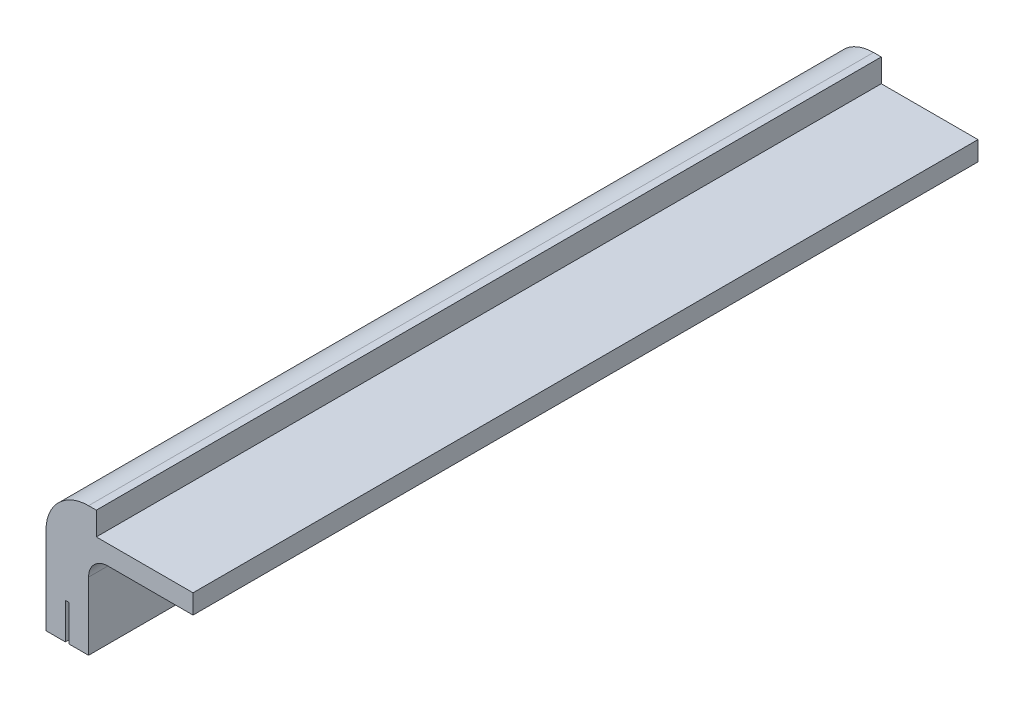
ISO-10303-21;
HEADER;
FILE_DESCRIPTION(('STEP AP214'),'2;1');
FILE_NAME('part.step','',(''),(''),'','','');
FILE_SCHEMA(('AUTOMOTIVE_DESIGN { 1 0 10303 214 1 1 1 1 }'));
ENDSEC;
DATA;
#1=APPLICATION_CONTEXT('core data for automotive mechanical design processes');
#2=APPLICATION_PROTOCOL_DEFINITION('international standard','automotive_design',2000,#1);
#3=PRODUCT_CONTEXT('',#1,'mechanical');
#4=PRODUCT('Part','Part','',(#3));
#5=PRODUCT_RELATED_PRODUCT_CATEGORY('part','',(#4));
#6=PRODUCT_DEFINITION_FORMATION('','',#4);
#7=PRODUCT_DEFINITION_CONTEXT('part definition',#1,'design');
#8=PRODUCT_DEFINITION('design','',#6,#7);
#9=PRODUCT_DEFINITION_SHAPE('','',#8);
#10=(LENGTH_UNIT() NAMED_UNIT(*) SI_UNIT(.MILLI.,.METRE.));
#11=(NAMED_UNIT(*) PLANE_ANGLE_UNIT() SI_UNIT($,.RADIAN.));
#12=(NAMED_UNIT(*) SI_UNIT($,.STERADIAN.) SOLID_ANGLE_UNIT());
#13=UNCERTAINTY_MEASURE_WITH_UNIT(LENGTH_MEASURE(1.E-05),#10,'distance_accuracy_value','');
#14=(GEOMETRIC_REPRESENTATION_CONTEXT(3) GLOBAL_UNCERTAINTY_ASSIGNED_CONTEXT((#13)) GLOBAL_UNIT_ASSIGNED_CONTEXT((#10,
#11,#12)) REPRESENTATION_CONTEXT('',''));
#15=CARTESIAN_POINT('',(0.,0.,0.));
#16=DIRECTION('',(0.,0.,1.));
#17=DIRECTION('',(1.,0.,0.));
#18=AXIS2_PLACEMENT_3D('',#15,#16,#17);
#19=CARTESIAN_POINT('',(-185.000000000001,220.,546.61442792579));
#20=DIRECTION('',(0.,0.,-1.));
#21=DIRECTION('',(0.,1.,0.));
#22=AXIS2_PLACEMENT_3D('',#19,#20,#21);
#23=PLANE('',#22);
#24=DIRECTION('',(0.,-1.,0.));
#25=VECTOR('',#24,1.);
#26=CARTESIAN_POINT('',(-191.,242.,546.61442792579));
#27=LINE('',#26,#25);
#28=CARTESIAN_POINT('',(-191.,252.,546.61442792579));
#29=VERTEX_POINT('',#28);
#30=CARTESIAN_POINT('',(-191.,240.,546.61442792579));
#31=VERTEX_POINT('',#30);
#32=EDGE_CURVE('E153',#29,#31,#27,.T.);
#33=ORIENTED_EDGE('',*,*,#32,.F.);
#34=DIRECTION('',(1.,0.,0.));
#35=VECTOR('',#34,1.);
#36=CARTESIAN_POINT('',(-195.000000000001,252.,546.61442792579));
#37=LINE('',#36,#35);
#38=CARTESIAN_POINT('',(-195.000000000001,252.,546.61442792579));
#39=VERTEX_POINT('',#38);
#40=EDGE_CURVE('E152',#39,#29,#37,.T.);
#41=ORIENTED_EDGE('',*,*,#40,.F.);
#42=CARTESIAN_POINT('',(-195.000000000001,230.,546.61442792579));
#43=DIRECTION('',(0.,0.,-1.));
#44=DIRECTION('',(0.,1.,0.));
#45=AXIS2_PLACEMENT_3D('',#42,#43,#44);
#46=CIRCLE('',#45,22.);
#47=CARTESIAN_POINT('',(-217.000000000001,230.,546.61442792579));
#48=VERTEX_POINT('',#47);
#49=EDGE_CURVE('E265',#48,#39,#46,.T.);
#50=ORIENTED_EDGE('',*,*,#49,.F.);
#51=DIRECTION('',(0.,1.,0.));
#52=VECTOR('',#51,1.);
#53=CARTESIAN_POINT('',(-217.000000000001,185.,546.61442792579));
#54=LINE('',#53,#52);
#55=CARTESIAN_POINT('',(-217.000000000001,185.,546.61442792579));
#56=VERTEX_POINT('',#55);
#57=EDGE_CURVE('E258',#56,#48,#54,.T.);
#58=ORIENTED_EDGE('',*,*,#57,.F.);
#59=DIRECTION('',(-1.,0.,0.));
#60=VECTOR('',#59,1.);
#61=CARTESIAN_POINT('',(-207.000000000001,185.,546.61442792579));
#62=LINE('',#61,#60);
#63=CARTESIAN_POINT('',(-207.000000000001,185.,546.61442792579));
#64=VERTEX_POINT('',#63);
#65=EDGE_CURVE('E251',#64,#56,#62,.T.);
#66=ORIENTED_EDGE('',*,*,#65,.F.);
#67=DIRECTION('',(0.,-1.,0.));
#68=VECTOR('',#67,1.);
#69=CARTESIAN_POINT('',(-207.000000000001,203.61075320275,546.61442792579));
#70=LINE('',#69,#68);
#71=CARTESIAN_POINT('',(-207.000000000001,203.61075320275,546.61442792579));
#72=VERTEX_POINT('',#71);
#73=EDGE_CURVE('E243',#72,#64,#70,.T.);
#74=ORIENTED_EDGE('',*,*,#73,.F.);
#75=DIRECTION('',(-1.,0.,0.));
#76=VECTOR('',#75,1.);
#77=CARTESIAN_POINT('',(-205.000000000001,203.61075320275,546.61442792579));
#78=LINE('',#77,#76);
#79=CARTESIAN_POINT('',(-205.000000000001,203.61075320275,546.61442792579));
#80=VERTEX_POINT('',#79);
#81=EDGE_CURVE('E236',#80,#72,#78,.T.);
#82=ORIENTED_EDGE('',*,*,#81,.F.);
#83=DIRECTION('',(0.,1.,0.));
#84=VECTOR('',#83,1.);
#85=CARTESIAN_POINT('',(-205.000000000001,185.,546.61442792579));
#86=LINE('',#85,#84);
#87=CARTESIAN_POINT('',(-205.000000000001,185.,546.61442792579));
#88=VERTEX_POINT('',#87);
#89=EDGE_CURVE('E275',#88,#80,#86,.T.);
#90=ORIENTED_EDGE('',*,*,#89,.F.);
#91=DIRECTION('',(-1.,0.,0.));
#92=VECTOR('',#91,1.);
#93=CARTESIAN_POINT('',(-195.000000000001,185.,546.61442792579));
#94=LINE('',#93,#92);
#95=CARTESIAN_POINT('',(-195.000000000001,185.,546.61442792579));
#96=VERTEX_POINT('',#95);
#97=EDGE_CURVE('E221',#96,#88,#94,.T.);
#98=ORIENTED_EDGE('',*,*,#97,.F.);
#99=DIRECTION('',(0.,-1.,0.));
#100=VECTOR('',#99,1.);
#101=CARTESIAN_POINT('',(-195.000000000001,220.,546.61442792579));
#102=LINE('',#101,#100);
#103=CARTESIAN_POINT('',(-195.000000000001,220.,546.61442792579));
#104=VERTEX_POINT('',#103);
#105=EDGE_CURVE('E214',#104,#96,#102,.T.);
#106=ORIENTED_EDGE('',*,*,#105,.F.);
#107=CARTESIAN_POINT('',(-185.000000000001,220.,546.61442792579));
#108=DIRECTION('',(0.,0.,1.));
#109=DIRECTION('',(0.,1.,0.));
#110=AXIS2_PLACEMENT_3D('',#107,#108,#109);
#111=CIRCLE('',#110,10.);
#112=CARTESIAN_POINT('',(-185.000000000001,230.,546.61442792579));
#113=VERTEX_POINT('',#112);
#114=EDGE_CURVE('E271',#113,#104,#111,.T.);
#115=ORIENTED_EDGE('',*,*,#114,.F.);
#116=DIRECTION('',(-1.,0.,0.));
#117=VECTOR('',#116,1.);
#118=CARTESIAN_POINT('',(-141.,230.,546.61442792579));
#119=LINE('',#118,#117);
#120=CARTESIAN_POINT('',(-141.,230.,546.61442792579));
#121=VERTEX_POINT('',#120);
#122=EDGE_CURVE('E199',#121,#113,#119,.T.);
#123=ORIENTED_EDGE('',*,*,#122,.F.);
#124=DIRECTION('',(0.,-1.,0.));
#125=VECTOR('',#124,1.);
#126=CARTESIAN_POINT('',(-141.,240.,546.61442792579));
#127=LINE('',#126,#125);
#128=CARTESIAN_POINT('',(-141.,240.,546.61442792579));
#129=VERTEX_POINT('',#128);
#130=EDGE_CURVE('E193',#129,#121,#127,.T.);
#131=ORIENTED_EDGE('',*,*,#130,.F.);
#132=DIRECTION('',(1.,0.,0.));
#133=VECTOR('',#132,1.);
#134=CARTESIAN_POINT('',(-152.5,240.,546.61442792579));
#135=LINE('',#134,#133);
#136=EDGE_CURVE('E148',#31,#129,#135,.T.);
#137=ORIENTED_EDGE('',*,*,#136,.F.);
#138=EDGE_LOOP('',(#33,#41,#50,#58,#66,#74,#82,#90,#98,#106,#115,#123,#131,#137));
#139=FACE_BOUND('',#138,.T.);
#140=ADVANCED_FACE('F33',(#139),#23,.F.);
#141=CARTESIAN_POINT('',(-195.000000000001,252.,39.5434754882849));
#142=DIRECTION('',(0.,-1.,0.));
#143=DIRECTION('',(0.,0.,-1.));
#144=AXIS2_PLACEMENT_3D('',#141,#142,#143);
#145=PLANE('',#144);
#146=ORIENTED_EDGE('',*,*,#40,.T.);
#147=DIRECTION('',(0.,0.,1.));
#148=VECTOR('',#147,1.);
#149=CARTESIAN_POINT('',(-191.,252.,140.859811782094));
#150=LINE('',#149,#148);
#151=CARTESIAN_POINT('',(-191.,252.,140.859811782094));
#152=VERTEX_POINT('',#151);
#153=EDGE_CURVE('E144',#152,#29,#150,.T.);
#154=ORIENTED_EDGE('',*,*,#153,.F.);
#155=DIRECTION('',(-1.,0.,0.));
#156=VECTOR('',#155,1.);
#157=CARTESIAN_POINT('',(-195.000000000001,252.,140.859811782094));
#158=LINE('',#157,#156);
#159=CARTESIAN_POINT('',(-195.000000000001,252.,140.859811782094));
#160=VERTEX_POINT('',#159);
#161=EDGE_CURVE('E92',#152,#160,#158,.T.);
#162=ORIENTED_EDGE('',*,*,#161,.T.);
#163=DIRECTION('',(0.,0.,1.));
#164=VECTOR('',#163,1.);
#165=CARTESIAN_POINT('',(-195.000000000001,252.,39.5434754882849));
#166=LINE('',#165,#164);
#167=EDGE_CURVE('E262',#160,#39,#166,.T.);
#168=ORIENTED_EDGE('',*,*,#167,.T.);
#169=EDGE_LOOP('',(#146,#154,#162,#168));
#170=FACE_BOUND('',#169,.T.);
#171=ADVANCED_FACE('F150',(#170),#145,.F.);
#172=CARTESIAN_POINT('',(-195.000000000001,230.,39.5434754882849));
#173=DIRECTION('',(0.,0.,1.));
#174=DIRECTION('',(0.,-1.,0.));
#175=AXIS2_PLACEMENT_3D('',#172,#173,#174);
#176=CYLINDRICAL_SURFACE('',#175,22.);
#177=ORIENTED_EDGE('',*,*,#167,.F.);
#178=CARTESIAN_POINT('',(-195.000000000001,230.,140.859811782094));
#179=DIRECTION('',(0.,0.,1.));
#180=DIRECTION('',(0.,-1.,0.));
#181=AXIS2_PLACEMENT_3D('',#178,#179,#180);
#182=CIRCLE('',#181,22.);
#183=CARTESIAN_POINT('',(-217.000000000001,230.,140.859811782094));
#184=VERTEX_POINT('',#183);
#185=EDGE_CURVE('E157',#160,#184,#182,.T.);
#186=ORIENTED_EDGE('',*,*,#185,.T.);
#187=DIRECTION('',(0.,0.,1.));
#188=VECTOR('',#187,1.);
#189=CARTESIAN_POINT('',(-217.000000000001,230.,39.5434754882849));
#190=LINE('',#189,#188);
#191=EDGE_CURVE('E255',#184,#48,#190,.T.);
#192=ORIENTED_EDGE('',*,*,#191,.T.);
#193=ORIENTED_EDGE('',*,*,#49,.T.);
#194=EDGE_LOOP('',(#177,#186,#192,#193));
#195=FACE_BOUND('',#194,.T.);
#196=ADVANCED_FACE('F264',(#195),#176,.T.);
#197=CARTESIAN_POINT('',(-217.000000000001,185.,39.5434754882849));
#198=DIRECTION('',(1.,0.,0.));
#199=DIRECTION('',(0.,0.,-1.));
#200=AXIS2_PLACEMENT_3D('',#197,#198,#199);
#201=PLANE('',#200);
#202=ORIENTED_EDGE('',*,*,#191,.F.);
#203=DIRECTION('',(0.,-1.,0.));
#204=VECTOR('',#203,1.);
#205=CARTESIAN_POINT('',(-217.000000000001,185.,140.859811782094));
#206=LINE('',#205,#204);
#207=CARTESIAN_POINT('',(-217.000000000001,185.,140.859811782094));
#208=VERTEX_POINT('',#207);
#209=EDGE_CURVE('E50',#184,#208,#206,.T.);
#210=ORIENTED_EDGE('',*,*,#209,.T.);
#211=DIRECTION('',(0.,0.,1.));
#212=VECTOR('',#211,1.);
#213=CARTESIAN_POINT('',(-217.000000000001,185.,39.5434754882849));
#214=LINE('',#213,#212);
#215=EDGE_CURVE('E247',#208,#56,#214,.T.);
#216=ORIENTED_EDGE('',*,*,#215,.T.);
#217=ORIENTED_EDGE('',*,*,#57,.T.);
#218=EDGE_LOOP('',(#202,#210,#216,#217));
#219=FACE_BOUND('',#218,.T.);
#220=ADVANCED_FACE('F257',(#219),#201,.F.);
#221=CARTESIAN_POINT('',(-207.000000000001,185.,39.5434754882849));
#222=DIRECTION('',(0.,1.,0.));
#223=DIRECTION('',(0.,0.,1.));
#224=AXIS2_PLACEMENT_3D('',#221,#222,#223);
#225=PLANE('',#224);
#226=ORIENTED_EDGE('',*,*,#215,.F.);
#227=DIRECTION('',(1.,0.,0.));
#228=VECTOR('',#227,1.);
#229=CARTESIAN_POINT('',(-207.000000000001,185.,140.859811782094));
#230=LINE('',#229,#228);
#231=CARTESIAN_POINT('',(-207.000000000001,185.,140.859811782094));
#232=VERTEX_POINT('',#231);
#233=EDGE_CURVE('E167',#208,#232,#230,.T.);
#234=ORIENTED_EDGE('',*,*,#233,.T.);
#235=DIRECTION('',(0.,0.,1.));
#236=VECTOR('',#235,1.);
#237=CARTESIAN_POINT('',(-207.000000000001,185.,39.5434754882849));
#238=LINE('',#237,#236);
#239=EDGE_CURVE('E240',#232,#64,#238,.T.);
#240=ORIENTED_EDGE('',*,*,#239,.T.);
#241=ORIENTED_EDGE('',*,*,#65,.T.);
#242=EDGE_LOOP('',(#226,#234,#240,#241));
#243=FACE_BOUND('',#242,.T.);
#244=ADVANCED_FACE('F250',(#243),#225,.F.);
#245=CARTESIAN_POINT('',(-207.000000000001,203.61075320275,39.5434754882849));
#246=DIRECTION('',(-1.,0.,0.));
#247=DIRECTION('',(0.,0.,1.));
#248=AXIS2_PLACEMENT_3D('',#245,#246,#247);
#249=PLANE('',#248);
#250=ORIENTED_EDGE('',*,*,#239,.F.);
#251=DIRECTION('',(0.,1.,0.));
#252=VECTOR('',#251,1.);
#253=CARTESIAN_POINT('',(-207.000000000001,203.61075320275,140.859811782094));
#254=LINE('',#253,#252);
#255=CARTESIAN_POINT('',(-207.000000000001,203.61075320275,140.859811782094));
#256=VERTEX_POINT('',#255);
#257=EDGE_CURVE('E170',#232,#256,#254,.T.);
#258=ORIENTED_EDGE('',*,*,#257,.T.);
#259=DIRECTION('',(0.,0.,1.));
#260=VECTOR('',#259,1.);
#261=CARTESIAN_POINT('',(-207.000000000001,203.61075320275,39.5434754882849));
#262=LINE('',#261,#260);
#263=EDGE_CURVE('E233',#256,#72,#262,.T.);
#264=ORIENTED_EDGE('',*,*,#263,.T.);
#265=ORIENTED_EDGE('',*,*,#73,.T.);
#266=EDGE_LOOP('',(#250,#258,#264,#265));
#267=FACE_BOUND('',#266,.T.);
#268=ADVANCED_FACE('F242',(#267),#249,.F.);
#269=CARTESIAN_POINT('',(-205.000000000001,203.61075320275,39.5434754882849));
#270=DIRECTION('',(0.,1.,0.));
#271=DIRECTION('',(0.,0.,1.));
#272=AXIS2_PLACEMENT_3D('',#269,#270,#271);
#273=PLANE('',#272);
#274=ORIENTED_EDGE('',*,*,#263,.F.);
#275=DIRECTION('',(1.,0.,0.));
#276=VECTOR('',#275,1.);
#277=CARTESIAN_POINT('',(-205.000000000001,203.61075320275,140.859811782094));
#278=LINE('',#277,#276);
#279=CARTESIAN_POINT('',(-205.000000000001,203.61075320275,140.859811782094));
#280=VERTEX_POINT('',#279);
#281=EDGE_CURVE('E173',#256,#280,#278,.T.);
#282=ORIENTED_EDGE('',*,*,#281,.T.);
#283=DIRECTION('',(0.,0.,1.));
#284=VECTOR('',#283,1.);
#285=CARTESIAN_POINT('',(-205.000000000001,203.61075320275,39.5434754882849));
#286=LINE('',#285,#284);
#287=EDGE_CURVE('E225',#280,#80,#286,.T.);
#288=ORIENTED_EDGE('',*,*,#287,.T.);
#289=ORIENTED_EDGE('',*,*,#81,.T.);
#290=EDGE_LOOP('',(#274,#282,#288,#289));
#291=FACE_BOUND('',#290,.T.);
#292=ADVANCED_FACE('F234',(#291),#273,.F.);
#293=CARTESIAN_POINT('',(-205.000000000001,185.,39.5434754882849));
#294=DIRECTION('',(1.,0.,0.));
#295=DIRECTION('',(0.,0.,-1.));
#296=AXIS2_PLACEMENT_3D('',#293,#294,#295);
#297=PLANE('',#296);
#298=ORIENTED_EDGE('',*,*,#287,.F.);
#299=DIRECTION('',(0.,-1.,0.));
#300=VECTOR('',#299,1.);
#301=CARTESIAN_POINT('',(-205.000000000001,185.,140.859811782094));
#302=LINE('',#301,#300);
#303=CARTESIAN_POINT('',(-205.000000000001,185.,140.859811782094));
#304=VERTEX_POINT('',#303);
#305=EDGE_CURVE('E176',#280,#304,#302,.T.);
#306=ORIENTED_EDGE('',*,*,#305,.T.);
#307=DIRECTION('',(0.,0.,1.));
#308=VECTOR('',#307,1.);
#309=CARTESIAN_POINT('',(-205.000000000001,185.,39.5434754882849));
#310=LINE('',#309,#308);
#311=EDGE_CURVE('E218',#304,#88,#310,.T.);
#312=ORIENTED_EDGE('',*,*,#311,.T.);
#313=ORIENTED_EDGE('',*,*,#89,.T.);
#314=EDGE_LOOP('',(#298,#306,#312,#313));
#315=FACE_BOUND('',#314,.T.);
#316=ADVANCED_FACE('F228',(#315),#297,.F.);
#317=CARTESIAN_POINT('',(-195.000000000001,185.,39.5434754882849));
#318=DIRECTION('',(0.,1.,0.));
#319=DIRECTION('',(0.,0.,1.));
#320=AXIS2_PLACEMENT_3D('',#317,#318,#319);
#321=PLANE('',#320);
#322=ORIENTED_EDGE('',*,*,#311,.F.);
#323=DIRECTION('',(1.,0.,0.));
#324=VECTOR('',#323,1.);
#325=CARTESIAN_POINT('',(-195.000000000001,185.,140.859811782094));
#326=LINE('',#325,#324);
#327=CARTESIAN_POINT('',(-195.000000000001,185.,140.859811782094));
#328=VERTEX_POINT('',#327);
#329=EDGE_CURVE('E179',#304,#328,#326,.T.);
#330=ORIENTED_EDGE('',*,*,#329,.T.);
#331=DIRECTION('',(0.,0.,1.));
#332=VECTOR('',#331,1.);
#333=CARTESIAN_POINT('',(-195.000000000001,185.,39.5434754882849));
#334=LINE('',#333,#332);
#335=EDGE_CURVE('E211',#328,#96,#334,.T.);
#336=ORIENTED_EDGE('',*,*,#335,.T.);
#337=ORIENTED_EDGE('',*,*,#97,.T.);
#338=EDGE_LOOP('',(#322,#330,#336,#337));
#339=FACE_BOUND('',#338,.T.);
#340=ADVANCED_FACE('F220',(#339),#321,.F.);
#341=CARTESIAN_POINT('',(-195.000000000001,220.,39.5434754882849));
#342=DIRECTION('',(-1.,0.,0.));
#343=DIRECTION('',(0.,0.,1.));
#344=AXIS2_PLACEMENT_3D('',#341,#342,#343);
#345=PLANE('',#344);
#346=ORIENTED_EDGE('',*,*,#335,.F.);
#347=DIRECTION('',(0.,1.,0.));
#348=VECTOR('',#347,1.);
#349=CARTESIAN_POINT('',(-195.000000000001,220.,140.859811782094));
#350=LINE('',#349,#348);
#351=CARTESIAN_POINT('',(-195.000000000001,220.,140.859811782094));
#352=VERTEX_POINT('',#351);
#353=EDGE_CURVE('E182',#328,#352,#350,.T.);
#354=ORIENTED_EDGE('',*,*,#353,.T.);
#355=DIRECTION('',(0.,0.,1.));
#356=VECTOR('',#355,1.);
#357=CARTESIAN_POINT('',(-195.000000000001,220.,39.5434754882849));
#358=LINE('',#357,#356);
#359=EDGE_CURVE('E203',#352,#104,#358,.T.);
#360=ORIENTED_EDGE('',*,*,#359,.T.);
#361=ORIENTED_EDGE('',*,*,#105,.T.);
#362=EDGE_LOOP('',(#346,#354,#360,#361));
#363=FACE_BOUND('',#362,.T.);
#364=ADVANCED_FACE('F212',(#363),#345,.F.);
#365=CARTESIAN_POINT('',(-185.000000000001,220.,39.5434754882849));
#366=DIRECTION('',(0.,0.,1.));
#367=DIRECTION('',(0.,-1.,0.));
#368=AXIS2_PLACEMENT_3D('',#365,#366,#367);
#369=CYLINDRICAL_SURFACE('',#368,10.);
#370=ORIENTED_EDGE('',*,*,#359,.F.);
#371=CARTESIAN_POINT('',(-185.000000000001,220.,140.859811782094));
#372=DIRECTION('',(0.,0.,1.));
#373=DIRECTION('',(0.,-1.,0.));
#374=AXIS2_PLACEMENT_3D('',#371,#372,#373);
#375=CIRCLE('',#374,10.);
#376=CARTESIAN_POINT('',(-185.000000000001,230.,140.859811782094));
#377=VERTEX_POINT('',#376);
#378=EDGE_CURVE('E185',#352,#377,#375,.F.);
#379=ORIENTED_EDGE('',*,*,#378,.T.);
#380=DIRECTION('',(0.,0.,1.));
#381=VECTOR('',#380,1.);
#382=CARTESIAN_POINT('',(-185.000000000001,230.,39.5434754882849));
#383=LINE('',#382,#381);
#384=EDGE_CURVE('E197',#377,#113,#383,.T.);
#385=ORIENTED_EDGE('',*,*,#384,.T.);
#386=ORIENTED_EDGE('',*,*,#114,.T.);
#387=EDGE_LOOP('',(#370,#379,#385,#386));
#388=FACE_BOUND('',#387,.T.);
#389=ADVANCED_FACE('F206',(#388),#369,.F.);
#390=CARTESIAN_POINT('',(-141.,230.,39.5434754882849));
#391=DIRECTION('',(0.,1.,0.));
#392=DIRECTION('',(0.,0.,1.));
#393=AXIS2_PLACEMENT_3D('',#390,#391,#392);
#394=PLANE('',#393);
#395=ORIENTED_EDGE('',*,*,#384,.F.);
#396=DIRECTION('',(1.,0.,0.));
#397=VECTOR('',#396,1.);
#398=CARTESIAN_POINT('',(-141.,230.,140.859811782094));
#399=LINE('',#398,#397);
#400=CARTESIAN_POINT('',(-141.,230.,140.859811782094));
#401=VERTEX_POINT('',#400);
#402=EDGE_CURVE('E78',#377,#401,#399,.T.);
#403=ORIENTED_EDGE('',*,*,#402,.T.);
#404=DIRECTION('',(0.,0.,1.));
#405=VECTOR('',#404,1.);
#406=CARTESIAN_POINT('',(-141.,230.,39.5434754882849));
#407=LINE('',#406,#405);
#408=EDGE_CURVE('E162',#401,#121,#407,.T.);
#409=ORIENTED_EDGE('',*,*,#408,.T.);
#410=ORIENTED_EDGE('',*,*,#122,.T.);
#411=EDGE_LOOP('',(#395,#403,#409,#410));
#412=FACE_BOUND('',#411,.T.);
#413=ADVANCED_FACE('F198',(#412),#394,.F.);
#414=CARTESIAN_POINT('',(-141.,240.,39.5434754882849));
#415=DIRECTION('',(-1.,0.,0.));
#416=DIRECTION('',(0.,-1.,0.));
#417=AXIS2_PLACEMENT_3D('',#414,#415,#416);
#418=PLANE('',#417);
#419=ORIENTED_EDGE('',*,*,#408,.F.);
#420=DIRECTION('',(0.,1.,0.));
#421=VECTOR('',#420,1.);
#422=CARTESIAN_POINT('',(-141.,240.,140.859811782094));
#423=LINE('',#422,#421);
#424=CARTESIAN_POINT('',(-141.,240.,140.859811782094));
#425=VERTEX_POINT('',#424);
#426=EDGE_CURVE('E42',#401,#425,#423,.T.);
#427=ORIENTED_EDGE('',*,*,#426,.T.);
#428=DIRECTION('',(0.,0.,1.));
#429=VECTOR('',#428,1.);
#430=CARTESIAN_POINT('',(-141.,240.,39.5434754882849));
#431=LINE('',#430,#429);
#432=EDGE_CURVE('E159',#425,#129,#431,.T.);
#433=ORIENTED_EDGE('',*,*,#432,.T.);
#434=ORIENTED_EDGE('',*,*,#130,.T.);
#435=EDGE_LOOP('',(#419,#427,#433,#434));
#436=FACE_BOUND('',#435,.T.);
#437=ADVANCED_FACE('F189',(#436),#418,.F.);
#438=CARTESIAN_POINT('',(-152.5,240.,39.5434754882849));
#439=DIRECTION('',(0.,-1.,0.));
#440=DIRECTION('',(0.,0.,-1.));
#441=AXIS2_PLACEMENT_3D('',#438,#439,#440);
#442=PLANE('',#441);
#443=ORIENTED_EDGE('',*,*,#432,.F.);
#444=DIRECTION('',(-1.,0.,0.));
#445=VECTOR('',#444,1.);
#446=CARTESIAN_POINT('',(-152.5,240.,140.859811782094));
#447=LINE('',#446,#445);
#448=CARTESIAN_POINT('',(-191.,240.,140.859811782094));
#449=VERTEX_POINT('',#448);
#450=EDGE_CURVE('E11',#425,#449,#447,.T.);
#451=ORIENTED_EDGE('',*,*,#450,.T.);
#452=DIRECTION('',(0.,0.,-1.));
#453=VECTOR('',#452,1.);
#454=CARTESIAN_POINT('',(-191.,240.,575.859811782094));
#455=LINE('',#454,#453);
#456=EDGE_CURVE('E147',#31,#449,#455,.T.);
#457=ORIENTED_EDGE('',*,*,#456,.F.);
#458=ORIENTED_EDGE('',*,*,#136,.T.);
#459=EDGE_LOOP('',(#443,#451,#457,#458));
#460=FACE_BOUND('',#459,.T.);
#461=ADVANCED_FACE('F35',(#460),#442,.F.);
#462=CARTESIAN_POINT('',(0.,14.2893616142883,140.859811782094));
#463=DIRECTION('',(0.,0.,1.));
#464=DIRECTION('',(0.,-1.,0.));
#465=AXIS2_PLACEMENT_3D('',#462,#463,#464);
#466=PLANE('',#465);
#467=ORIENTED_EDGE('',*,*,#161,.F.);
#468=DIRECTION('',(0.,-1.,0.));
#469=VECTOR('',#468,1.);
#470=CARTESIAN_POINT('',(-191.,242.,140.859811782094));
#471=LINE('',#470,#469);
#472=EDGE_CURVE('E141',#152,#449,#471,.T.);
#473=ORIENTED_EDGE('',*,*,#472,.T.);
#474=ORIENTED_EDGE('',*,*,#450,.F.);
#475=ORIENTED_EDGE('',*,*,#426,.F.);
#476=ORIENTED_EDGE('',*,*,#402,.F.);
#477=ORIENTED_EDGE('',*,*,#378,.F.);
#478=ORIENTED_EDGE('',*,*,#353,.F.);
#479=ORIENTED_EDGE('',*,*,#329,.F.);
#480=ORIENTED_EDGE('',*,*,#305,.F.);
#481=ORIENTED_EDGE('',*,*,#281,.F.);
#482=ORIENTED_EDGE('',*,*,#257,.F.);
#483=ORIENTED_EDGE('',*,*,#233,.F.);
#484=ORIENTED_EDGE('',*,*,#209,.F.);
#485=ORIENTED_EDGE('',*,*,#185,.F.);
#486=EDGE_LOOP('',(#467,#473,#474,#475,#476,#477,#478,#479,#480,#481,#482,#483,#484,#485));
#487=FACE_BOUND('',#486,.T.);
#488=ADVANCED_FACE('F155',(#487),#466,.F.);
#489=CARTESIAN_POINT('',(-191.,242.,575.859811782094));
#490=DIRECTION('',(-1.,0.,0.));
#491=DIRECTION('',(0.,1.,0.));
#492=AXIS2_PLACEMENT_3D('',#489,#490,#491);
#493=PLANE('',#492);
#494=ORIENTED_EDGE('',*,*,#32,.T.);
#495=ORIENTED_EDGE('',*,*,#456,.T.);
#496=ORIENTED_EDGE('',*,*,#472,.F.);
#497=ORIENTED_EDGE('',*,*,#153,.T.);
#498=EDGE_LOOP('',(#494,#495,#496,#497));
#499=FACE_BOUND('',#498,.T.);
#500=ADVANCED_FACE('F143',(#499),#493,.F.);
#501=CLOSED_SHELL('',(#140,#171,#196,#220,#244,#268,#292,#316,#340,#364,#389,#413,#437,#461,
#488,#500));
#502=MANIFOLD_SOLID_BREP('B2',#501);
#503=ADVANCED_BREP_SHAPE_REPRESENTATION('',(#18,#502),#14);
#504=SHAPE_DEFINITION_REPRESENTATION(#9,#503);
ENDSEC;
END-ISO-10303-21;
